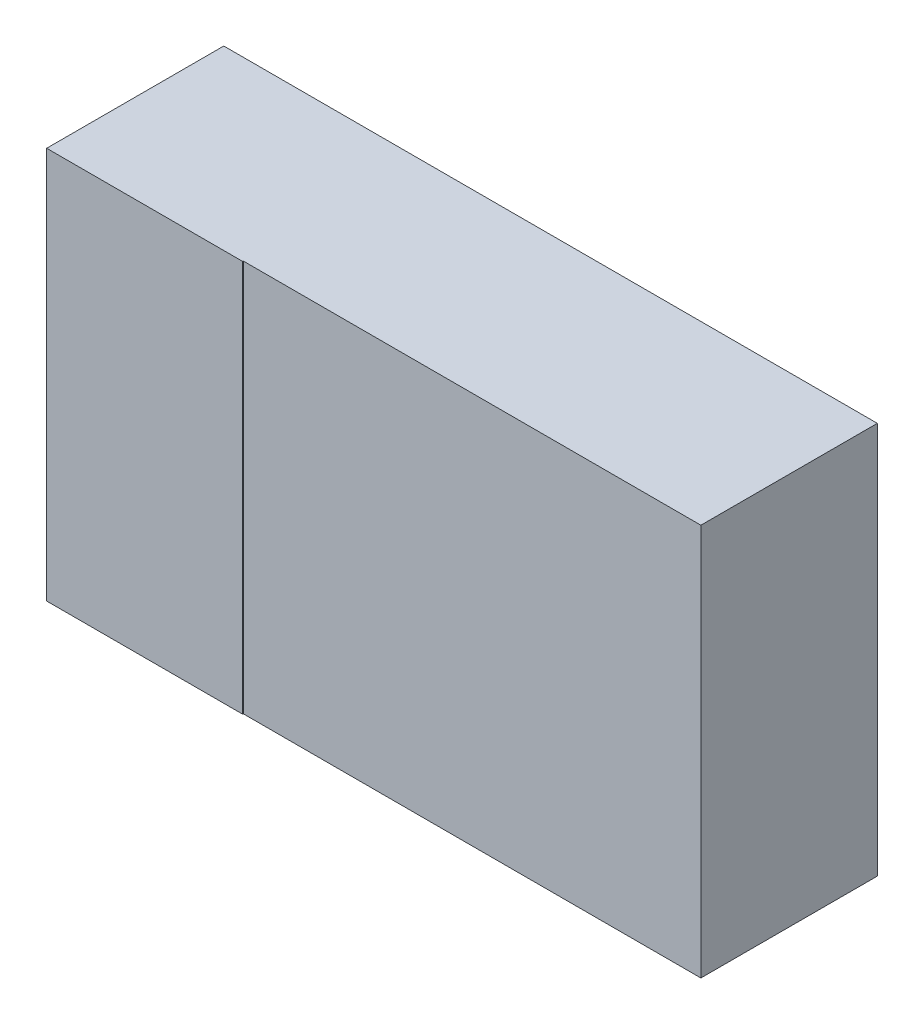
ISO-10303-21;
HEADER;
FILE_DESCRIPTION(('STEP AP214'),'2;1');
FILE_NAME('part.step','',(''),(''),'','','');
FILE_SCHEMA(('AUTOMOTIVE_DESIGN { 1 0 10303 214 1 1 1 1 }'));
ENDSEC;
DATA;
#1=APPLICATION_CONTEXT('core data for automotive mechanical design processes');
#2=APPLICATION_PROTOCOL_DEFINITION('international standard','automotive_design',2000,#1);
#3=PRODUCT_CONTEXT('',#1,'mechanical');
#4=PRODUCT('Part','Part','',(#3));
#5=PRODUCT_RELATED_PRODUCT_CATEGORY('part','',(#4));
#6=PRODUCT_DEFINITION_FORMATION('','',#4);
#7=PRODUCT_DEFINITION_CONTEXT('part definition',#1,'design');
#8=PRODUCT_DEFINITION('design','',#6,#7);
#9=PRODUCT_DEFINITION_SHAPE('','',#8);
#10=(LENGTH_UNIT() NAMED_UNIT(*) SI_UNIT(.MILLI.,.METRE.));
#11=(NAMED_UNIT(*) PLANE_ANGLE_UNIT() SI_UNIT($,.RADIAN.));
#12=(NAMED_UNIT(*) SI_UNIT($,.STERADIAN.) SOLID_ANGLE_UNIT());
#13=UNCERTAINTY_MEASURE_WITH_UNIT(LENGTH_MEASURE(1.E-05),#10,'distance_accuracy_value','');
#14=(GEOMETRIC_REPRESENTATION_CONTEXT(3) GLOBAL_UNCERTAINTY_ASSIGNED_CONTEXT((#13)) GLOBAL_UNIT_ASSIGNED_CONTEXT((#10,
#11,#12)) REPRESENTATION_CONTEXT('',''));
#15=CARTESIAN_POINT('',(0.,0.,0.));
#16=DIRECTION('',(0.,0.,1.));
#17=DIRECTION('',(1.,0.,0.));
#18=AXIS2_PLACEMENT_3D('',#15,#16,#17);
#19=CARTESIAN_POINT('',(0.,0.,0.3));
#20=DIRECTION('',(0.,0.,-1.));
#21=DIRECTION('',(-1.,0.,0.));
#22=AXIS2_PLACEMENT_3D('',#19,#20,#21);
#23=PLANE('',#22);
#24=DIRECTION('',(0.,1.,0.));
#25=VECTOR('',#24,1.);
#26=CARTESIAN_POINT('',(-0.2,0.3,0.3));
#27=LINE('',#26,#25);
#28=CARTESIAN_POINT('',(-0.2,-0.3,0.3));
#29=VERTEX_POINT('',#28);
#30=CARTESIAN_POINT('',(-0.2,0.3,0.3));
#31=VERTEX_POINT('',#30);
#32=EDGE_CURVE('E52',#29,#31,#27,.T.);
#33=ORIENTED_EDGE('',*,*,#32,.F.);
#34=DIRECTION('',(1.,0.,0.));
#35=VECTOR('',#34,1.);
#36=CARTESIAN_POINT('',(0.5,-0.3,0.3));
#37=LINE('',#36,#35);
#38=CARTESIAN_POINT('',(0.5,-0.3,0.3));
#39=VERTEX_POINT('',#38);
#40=EDGE_CURVE('E205',#29,#39,#37,.T.);
#41=ORIENTED_EDGE('',*,*,#40,.T.);
#42=DIRECTION('',(0.,1.,0.));
#43=VECTOR('',#42,1.);
#44=CARTESIAN_POINT('',(0.5,0.3,0.3));
#45=LINE('',#44,#43);
#46=CARTESIAN_POINT('',(0.5,0.3,0.3));
#47=VERTEX_POINT('',#46);
#48=EDGE_CURVE('E207',#39,#47,#45,.T.);
#49=ORIENTED_EDGE('',*,*,#48,.T.);
#50=DIRECTION('',(-1.,0.,0.));
#51=VECTOR('',#50,1.);
#52=CARTESIAN_POINT('',(0.5,0.3,0.3));
#53=LINE('',#52,#51);
#54=EDGE_CURVE('E210',#47,#31,#53,.T.);
#55=ORIENTED_EDGE('',*,*,#54,.T.);
#56=EDGE_LOOP('',(#33,#41,#49,#55));
#57=FACE_BOUND('',#56,.T.);
#58=ADVANCED_FACE('F37',(#57),#23,.F.);
#59=CARTESIAN_POINT('',(0.,0.,0.03));
#60=DIRECTION('',(0.,0.,-1.));
#61=DIRECTION('',(-1.,0.,0.));
#62=AXIS2_PLACEMENT_3D('',#59,#60,#61);
#63=PLANE('',#62);
#64=DIRECTION('',(1.,0.,0.));
#65=VECTOR('',#64,1.);
#66=CARTESIAN_POINT('',(-0.45,-0.25,0.03));
#67=LINE('',#66,#65);
#68=CARTESIAN_POINT('',(-0.45,-0.25,0.03));
#69=VERTEX_POINT('',#68);
#70=CARTESIAN_POINT('',(-0.2,-0.25,0.03));
#71=VERTEX_POINT('',#70);
#72=EDGE_CURVE('E235',#69,#71,#67,.T.);
#73=ORIENTED_EDGE('',*,*,#72,.T.);
#74=DIRECTION('',(0.,1.,0.));
#75=VECTOR('',#74,1.);
#76=CARTESIAN_POINT('',(-0.2,0.25,0.03));
#77=LINE('',#76,#75);
#78=CARTESIAN_POINT('',(-0.2,0.25,0.03));
#79=VERTEX_POINT('',#78);
#80=EDGE_CURVE('E225',#71,#79,#77,.T.);
#81=ORIENTED_EDGE('',*,*,#80,.T.);
#82=DIRECTION('',(-1.,0.,0.));
#83=VECTOR('',#82,1.);
#84=CARTESIAN_POINT('',(-0.45,0.25,0.03));
#85=LINE('',#84,#83);
#86=CARTESIAN_POINT('',(-0.45,0.25,0.03));
#87=VERTEX_POINT('',#86);
#88=EDGE_CURVE('E228',#79,#87,#85,.T.);
#89=ORIENTED_EDGE('',*,*,#88,.T.);
#90=DIRECTION('',(0.,-1.,0.));
#91=VECTOR('',#90,1.);
#92=CARTESIAN_POINT('',(-0.45,0.25,0.03));
#93=LINE('',#92,#91);
#94=EDGE_CURVE('E232',#87,#69,#93,.T.);
#95=ORIENTED_EDGE('',*,*,#94,.T.);
#96=EDGE_LOOP('',(#73,#81,#89,#95));
#97=FACE_BOUND('',#96,.T.);
#98=DIRECTION('',(0.,-1.,0.));
#99=VECTOR('',#98,1.);
#100=CARTESIAN_POINT('',(-0.5,0.3,0.03));
#101=LINE('',#100,#99);
#102=CARTESIAN_POINT('',(-0.5,0.3,0.03));
#103=VERTEX_POINT('',#102);
#104=CARTESIAN_POINT('',(-0.5,-0.3,0.03));
#105=VERTEX_POINT('',#104);
#106=EDGE_CURVE('E148',#103,#105,#101,.T.);
#107=ORIENTED_EDGE('',*,*,#106,.F.);
#108=DIRECTION('',(-1.,0.,0.));
#109=VECTOR('',#108,1.);
#110=CARTESIAN_POINT('',(0.5,0.3,0.03));
#111=LINE('',#110,#109);
#112=CARTESIAN_POINT('',(0.5,0.3,0.03));
#113=VERTEX_POINT('',#112);
#114=EDGE_CURVE('E208',#113,#103,#111,.T.);
#115=ORIENTED_EDGE('',*,*,#114,.F.);
#116=DIRECTION('',(0.,1.,0.));
#117=VECTOR('',#116,1.);
#118=CARTESIAN_POINT('',(0.5,0.3,0.03));
#119=LINE('',#118,#117);
#120=CARTESIAN_POINT('',(0.5,-0.3,0.03));
#121=VERTEX_POINT('',#120);
#122=EDGE_CURVE('E216',#121,#113,#119,.T.);
#123=ORIENTED_EDGE('',*,*,#122,.F.);
#124=DIRECTION('',(1.,0.,0.));
#125=VECTOR('',#124,1.);
#126=CARTESIAN_POINT('',(0.5,-0.3,0.03));
#127=LINE('',#126,#125);
#128=EDGE_CURVE('E214',#105,#121,#127,.T.);
#129=ORIENTED_EDGE('',*,*,#128,.F.);
#130=EDGE_LOOP('',(#107,#115,#123,#129));
#131=FACE_BOUND('',#130,.T.);
#132=DIRECTION('',(1.,0.,0.));
#133=VECTOR('',#132,1.);
#134=CARTESIAN_POINT('',(0.45,-0.25,0.03));
#135=LINE('',#134,#133);
#136=CARTESIAN_POINT('',(0.2,-0.25,0.03));
#137=VERTEX_POINT('',#136);
#138=CARTESIAN_POINT('',(0.45,-0.25,0.03));
#139=VERTEX_POINT('',#138);
#140=EDGE_CURVE('E184',#137,#139,#135,.T.);
#141=ORIENTED_EDGE('',*,*,#140,.T.);
#142=DIRECTION('',(0.,1.,0.));
#143=VECTOR('',#142,1.);
#144=CARTESIAN_POINT('',(0.45,0.25,0.03));
#145=LINE('',#144,#143);
#146=CARTESIAN_POINT('',(0.45,0.25,0.03));
#147=VERTEX_POINT('',#146);
#148=EDGE_CURVE('E60',#139,#147,#145,.T.);
#149=ORIENTED_EDGE('',*,*,#148,.T.);
#150=DIRECTION('',(-1.,0.,0.));
#151=VECTOR('',#150,1.);
#152=CARTESIAN_POINT('',(0.45,0.25,0.03));
#153=LINE('',#152,#151);
#154=CARTESIAN_POINT('',(0.2,0.25,0.03));
#155=VERTEX_POINT('',#154);
#156=EDGE_CURVE('E177',#147,#155,#153,.T.);
#157=ORIENTED_EDGE('',*,*,#156,.T.);
#158=DIRECTION('',(0.,-1.,0.));
#159=VECTOR('',#158,1.);
#160=CARTESIAN_POINT('',(0.2,0.25,0.03));
#161=LINE('',#160,#159);
#162=EDGE_CURVE('E181',#155,#137,#161,.T.);
#163=ORIENTED_EDGE('',*,*,#162,.T.);
#164=EDGE_LOOP('',(#141,#149,#157,#163));
#165=FACE_BOUND('',#164,.T.);
#166=ADVANCED_FACE('F267',(#97,#131,#165),#63,.T.);
#167=CARTESIAN_POINT('',(-0.2,0.25,0.03));
#168=DIRECTION('',(-1.,0.,0.));
#169=DIRECTION('',(0.,0.,1.));
#170=AXIS2_PLACEMENT_3D('',#167,#168,#169);
#171=PLANE('',#170);
#172=DIRECTION('',(0.,1.,0.));
#173=VECTOR('',#172,1.);
#174=CARTESIAN_POINT('',(-0.2,0.25,0.));
#175=LINE('',#174,#173);
#176=CARTESIAN_POINT('',(-0.2,-0.25,0.));
#177=VERTEX_POINT('',#176);
#178=CARTESIAN_POINT('',(-0.2,0.25,0.));
#179=VERTEX_POINT('',#178);
#180=EDGE_CURVE('E150',#177,#179,#175,.T.);
#181=ORIENTED_EDGE('',*,*,#180,.T.);
#182=DIRECTION('',(0.,0.,-1.));
#183=VECTOR('',#182,1.);
#184=CARTESIAN_POINT('',(-0.2,0.25,0.03));
#185=LINE('',#184,#183);
#186=EDGE_CURVE('E11',#79,#179,#185,.T.);
#187=ORIENTED_EDGE('',*,*,#186,.F.);
#188=ORIENTED_EDGE('',*,*,#80,.F.);
#189=DIRECTION('',(0.,0.,-1.));
#190=VECTOR('',#189,1.);
#191=CARTESIAN_POINT('',(-0.2,-0.25,0.03));
#192=LINE('',#191,#190);
#193=EDGE_CURVE('E238',#71,#177,#192,.T.);
#194=ORIENTED_EDGE('',*,*,#193,.T.);
#195=EDGE_LOOP('',(#181,#187,#188,#194));
#196=FACE_BOUND('',#195,.T.);
#197=ADVANCED_FACE('F39',(#196),#171,.F.);
#198=CARTESIAN_POINT('',(-0.45,0.25,0.03));
#199=DIRECTION('',(0.,-1.,0.));
#200=DIRECTION('',(0.,0.,-1.));
#201=AXIS2_PLACEMENT_3D('',#198,#199,#200);
#202=PLANE('',#201);
#203=DIRECTION('',(-1.,0.,0.));
#204=VECTOR('',#203,1.);
#205=CARTESIAN_POINT('',(-0.45,0.25,0.));
#206=LINE('',#205,#204);
#207=CARTESIAN_POINT('',(-0.45,0.25,0.));
#208=VERTEX_POINT('',#207);
#209=EDGE_CURVE('E241',#179,#208,#206,.T.);
#210=ORIENTED_EDGE('',*,*,#209,.T.);
#211=DIRECTION('',(0.,0.,-1.));
#212=VECTOR('',#211,1.);
#213=CARTESIAN_POINT('',(-0.45,0.25,0.03));
#214=LINE('',#213,#212);
#215=EDGE_CURVE('E45',#87,#208,#214,.T.);
#216=ORIENTED_EDGE('',*,*,#215,.F.);
#217=ORIENTED_EDGE('',*,*,#88,.F.);
#218=ORIENTED_EDGE('',*,*,#186,.T.);
#219=EDGE_LOOP('',(#210,#216,#217,#218));
#220=FACE_BOUND('',#219,.T.);
#221=ADVANCED_FACE('F269',(#220),#202,.F.);
#222=CARTESIAN_POINT('',(-0.45,0.25,0.03));
#223=DIRECTION('',(1.,0.,0.));
#224=DIRECTION('',(0.,1.,0.));
#225=AXIS2_PLACEMENT_3D('',#222,#223,#224);
#226=PLANE('',#225);
#227=DIRECTION('',(0.,-1.,0.));
#228=VECTOR('',#227,1.);
#229=CARTESIAN_POINT('',(-0.45,0.25,0.));
#230=LINE('',#229,#228);
#231=CARTESIAN_POINT('',(-0.45,-0.25,0.));
#232=VERTEX_POINT('',#231);
#233=EDGE_CURVE('E243',#208,#232,#230,.T.);
#234=ORIENTED_EDGE('',*,*,#233,.T.);
#235=DIRECTION('',(0.,0.,-1.));
#236=VECTOR('',#235,1.);
#237=CARTESIAN_POINT('',(-0.45,-0.25,0.03));
#238=LINE('',#237,#236);
#239=EDGE_CURVE('E248',#69,#232,#238,.T.);
#240=ORIENTED_EDGE('',*,*,#239,.F.);
#241=ORIENTED_EDGE('',*,*,#94,.F.);
#242=ORIENTED_EDGE('',*,*,#215,.T.);
#243=EDGE_LOOP('',(#234,#240,#241,#242));
#244=FACE_BOUND('',#243,.T.);
#245=ADVANCED_FACE('F254',(#244),#226,.F.);
#246=CARTESIAN_POINT('',(-0.45,-0.25,0.03));
#247=DIRECTION('',(0.,1.,0.));
#248=DIRECTION('',(0.,0.,1.));
#249=AXIS2_PLACEMENT_3D('',#246,#247,#248);
#250=PLANE('',#249);
#251=DIRECTION('',(1.,0.,0.));
#252=VECTOR('',#251,1.);
#253=CARTESIAN_POINT('',(-0.45,-0.25,0.));
#254=LINE('',#253,#252);
#255=EDGE_CURVE('E229',#232,#177,#254,.T.);
#256=ORIENTED_EDGE('',*,*,#255,.T.);
#257=ORIENTED_EDGE('',*,*,#193,.F.);
#258=ORIENTED_EDGE('',*,*,#72,.F.);
#259=ORIENTED_EDGE('',*,*,#239,.T.);
#260=EDGE_LOOP('',(#256,#257,#258,#259));
#261=FACE_BOUND('',#260,.T.);
#262=ADVANCED_FACE('F262',(#261),#250,.F.);
#263=CARTESIAN_POINT('',(0.,0.,0.));
#264=DIRECTION('',(0.,0.,1.));
#265=DIRECTION('',(1.,0.,0.));
#266=AXIS2_PLACEMENT_3D('',#263,#264,#265);
#267=PLANE('',#266);
#268=ORIENTED_EDGE('',*,*,#180,.F.);
#269=ORIENTED_EDGE('',*,*,#255,.F.);
#270=ORIENTED_EDGE('',*,*,#233,.F.);
#271=ORIENTED_EDGE('',*,*,#209,.F.);
#272=EDGE_LOOP('',(#268,#269,#270,#271));
#273=FACE_BOUND('',#272,.T.);
#274=ADVANCED_FACE('F259',(#273),#267,.F.);
#275=CARTESIAN_POINT('',(-0.5,0.3,0.3));
#276=DIRECTION('',(1.,0.,0.));
#277=DIRECTION('',(0.,0.,-1.));
#278=AXIS2_PLACEMENT_3D('',#275,#276,#277);
#279=PLANE('',#278);
#280=ORIENTED_EDGE('',*,*,#106,.T.);
#281=DIRECTION('',(0.,0.,-1.));
#282=VECTOR('',#281,1.);
#283=CARTESIAN_POINT('',(-0.5,-0.3,0.3));
#284=LINE('',#283,#282);
#285=CARTESIAN_POINT('',(-0.5,-0.3,0.301));
#286=VERTEX_POINT('',#285);
#287=EDGE_CURVE('E141',#286,#105,#284,.T.);
#288=ORIENTED_EDGE('',*,*,#287,.F.);
#289=DIRECTION('',(0.,-1.,0.));
#290=VECTOR('',#289,1.);
#291=CARTESIAN_POINT('',(-0.5,0.3,0.301));
#292=LINE('',#291,#290);
#293=CARTESIAN_POINT('',(-0.5,0.3,0.301));
#294=VERTEX_POINT('',#293);
#295=EDGE_CURVE('E146',#294,#286,#292,.T.);
#296=ORIENTED_EDGE('',*,*,#295,.F.);
#297=DIRECTION('',(0.,0.,-1.));
#298=VECTOR('',#297,1.);
#299=CARTESIAN_POINT('',(-0.5,0.3,0.3));
#300=LINE('',#299,#298);
#301=EDGE_CURVE('E212',#294,#103,#300,.T.);
#302=ORIENTED_EDGE('',*,*,#301,.T.);
#303=EDGE_LOOP('',(#280,#288,#296,#302));
#304=FACE_BOUND('',#303,.T.);
#305=ADVANCED_FACE('F143',(#304),#279,.F.);
#306=CARTESIAN_POINT('',(0.5,-0.3,0.3));
#307=DIRECTION('',(0.,1.,0.));
#308=DIRECTION('',(-1.,0.,0.));
#309=AXIS2_PLACEMENT_3D('',#306,#307,#308);
#310=PLANE('',#309);
#311=ORIENTED_EDGE('',*,*,#128,.T.);
#312=DIRECTION('',(0.,0.,-1.));
#313=VECTOR('',#312,1.);
#314=CARTESIAN_POINT('',(0.5,-0.3,0.3));
#315=LINE('',#314,#313);
#316=EDGE_CURVE('E151',#39,#121,#315,.T.);
#317=ORIENTED_EDGE('',*,*,#316,.F.);
#318=ORIENTED_EDGE('',*,*,#40,.F.);
#319=DIRECTION('',(0.,0.,-1.));
#320=VECTOR('',#319,1.);
#321=CARTESIAN_POINT('',(-0.2,-0.3,0.301));
#322=LINE('',#321,#320);
#323=CARTESIAN_POINT('',(-0.2,-0.3,0.301));
#324=VERTEX_POINT('',#323);
#325=EDGE_CURVE('E157',#324,#29,#322,.T.);
#326=ORIENTED_EDGE('',*,*,#325,.F.);
#327=DIRECTION('',(1.,0.,0.));
#328=VECTOR('',#327,1.);
#329=CARTESIAN_POINT('',(-0.5,-0.3,0.301));
#330=LINE('',#329,#328);
#331=EDGE_CURVE('E154',#286,#324,#330,.T.);
#332=ORIENTED_EDGE('',*,*,#331,.F.);
#333=ORIENTED_EDGE('',*,*,#287,.T.);
#334=EDGE_LOOP('',(#311,#317,#318,#326,#332,#333));
#335=FACE_BOUND('',#334,.T.);
#336=ADVANCED_FACE('F155',(#335),#310,.F.);
#337=CARTESIAN_POINT('',(0.5,0.3,0.3));
#338=DIRECTION('',(-1.,0.,0.));
#339=DIRECTION('',(0.,-1.,0.));
#340=AXIS2_PLACEMENT_3D('',#337,#338,#339);
#341=PLANE('',#340);
#342=ORIENTED_EDGE('',*,*,#122,.T.);
#343=DIRECTION('',(0.,0.,-1.));
#344=VECTOR('',#343,1.);
#345=CARTESIAN_POINT('',(0.5,0.3,0.3));
#346=LINE('',#345,#344);
#347=EDGE_CURVE('E220',#47,#113,#346,.T.);
#348=ORIENTED_EDGE('',*,*,#347,.F.);
#349=ORIENTED_EDGE('',*,*,#48,.F.);
#350=ORIENTED_EDGE('',*,*,#316,.T.);
#351=EDGE_LOOP('',(#342,#348,#349,#350));
#352=FACE_BOUND('',#351,.T.);
#353=ADVANCED_FACE('F289',(#352),#341,.F.);
#354=CARTESIAN_POINT('',(0.5,0.3,0.3));
#355=DIRECTION('',(0.,-1.,0.));
#356=DIRECTION('',(1.,0.,0.));
#357=AXIS2_PLACEMENT_3D('',#354,#355,#356);
#358=PLANE('',#357);
#359=ORIENTED_EDGE('',*,*,#114,.T.);
#360=ORIENTED_EDGE('',*,*,#301,.F.);
#361=DIRECTION('',(-1.,0.,0.));
#362=VECTOR('',#361,1.);
#363=CARTESIAN_POINT('',(-0.5,0.3,0.301));
#364=LINE('',#363,#362);
#365=CARTESIAN_POINT('',(-0.2,0.3,0.301));
#366=VERTEX_POINT('',#365);
#367=EDGE_CURVE('E165',#366,#294,#364,.T.);
#368=ORIENTED_EDGE('',*,*,#367,.F.);
#369=DIRECTION('',(0.,0.,-1.));
#370=VECTOR('',#369,1.);
#371=CARTESIAN_POINT('',(-0.2,0.3,0.301));
#372=LINE('',#371,#370);
#373=EDGE_CURVE('E170',#366,#31,#372,.T.);
#374=ORIENTED_EDGE('',*,*,#373,.T.);
#375=ORIENTED_EDGE('',*,*,#54,.F.);
#376=ORIENTED_EDGE('',*,*,#347,.T.);
#377=EDGE_LOOP('',(#359,#360,#368,#374,#375,#376));
#378=FACE_BOUND('',#377,.T.);
#379=ADVANCED_FACE('F286',(#378),#358,.F.);
#380=CARTESIAN_POINT('',(0.45,0.25,0.03));
#381=DIRECTION('',(-1.,0.,0.));
#382=DIRECTION('',(0.,-1.,0.));
#383=AXIS2_PLACEMENT_3D('',#380,#381,#382);
#384=PLANE('',#383);
#385=DIRECTION('',(0.,1.,0.));
#386=VECTOR('',#385,1.);
#387=CARTESIAN_POINT('',(0.45,0.25,0.));
#388=LINE('',#387,#386);
#389=CARTESIAN_POINT('',(0.45,-0.25,0.));
#390=VERTEX_POINT('',#389);
#391=CARTESIAN_POINT('',(0.45,0.25,0.));
#392=VERTEX_POINT('',#391);
#393=EDGE_CURVE('E175',#390,#392,#388,.T.);
#394=ORIENTED_EDGE('',*,*,#393,.T.);
#395=DIRECTION('',(0.,0.,-1.));
#396=VECTOR('',#395,1.);
#397=CARTESIAN_POINT('',(0.45,0.25,0.03));
#398=LINE('',#397,#396);
#399=EDGE_CURVE('E202',#147,#392,#398,.T.);
#400=ORIENTED_EDGE('',*,*,#399,.F.);
#401=ORIENTED_EDGE('',*,*,#148,.F.);
#402=DIRECTION('',(0.,0.,-1.));
#403=VECTOR('',#402,1.);
#404=CARTESIAN_POINT('',(0.45,-0.25,0.03));
#405=LINE('',#404,#403);
#406=EDGE_CURVE('E187',#139,#390,#405,.T.);
#407=ORIENTED_EDGE('',*,*,#406,.T.);
#408=EDGE_LOOP('',(#394,#400,#401,#407));
#409=FACE_BOUND('',#408,.T.);
#410=ADVANCED_FACE('F283',(#409),#384,.F.);
#411=CARTESIAN_POINT('',(0.45,0.25,0.03));
#412=DIRECTION('',(0.,-1.,0.));
#413=DIRECTION('',(1.,0.,0.));
#414=AXIS2_PLACEMENT_3D('',#411,#412,#413);
#415=PLANE('',#414);
#416=DIRECTION('',(-1.,0.,0.));
#417=VECTOR('',#416,1.);
#418=CARTESIAN_POINT('',(0.45,0.25,0.));
#419=LINE('',#418,#417);
#420=CARTESIAN_POINT('',(0.2,0.25,0.));
#421=VERTEX_POINT('',#420);
#422=EDGE_CURVE('E190',#392,#421,#419,.T.);
#423=ORIENTED_EDGE('',*,*,#422,.T.);
#424=DIRECTION('',(0.,0.,-1.));
#425=VECTOR('',#424,1.);
#426=CARTESIAN_POINT('',(0.2,0.25,0.03));
#427=LINE('',#426,#425);
#428=EDGE_CURVE('E199',#155,#421,#427,.T.);
#429=ORIENTED_EDGE('',*,*,#428,.F.);
#430=ORIENTED_EDGE('',*,*,#156,.F.);
#431=ORIENTED_EDGE('',*,*,#399,.T.);
#432=EDGE_LOOP('',(#423,#429,#430,#431));
#433=FACE_BOUND('',#432,.T.);
#434=ADVANCED_FACE('F333',(#433),#415,.F.);
#435=CARTESIAN_POINT('',(0.2,0.25,0.03));
#436=DIRECTION('',(1.,0.,0.));
#437=DIRECTION('',(0.,1.,0.));
#438=AXIS2_PLACEMENT_3D('',#435,#436,#437);
#439=PLANE('',#438);
#440=DIRECTION('',(0.,-1.,0.));
#441=VECTOR('',#440,1.);
#442=CARTESIAN_POINT('',(0.2,0.25,0.));
#443=LINE('',#442,#441);
#444=CARTESIAN_POINT('',(0.2,-0.25,0.));
#445=VERTEX_POINT('',#444);
#446=EDGE_CURVE('E192',#421,#445,#443,.T.);
#447=ORIENTED_EDGE('',*,*,#446,.T.);
#448=DIRECTION('',(0.,0.,-1.));
#449=VECTOR('',#448,1.);
#450=CARTESIAN_POINT('',(0.2,-0.25,0.03));
#451=LINE('',#450,#449);
#452=EDGE_CURVE('E196',#137,#445,#451,.T.);
#453=ORIENTED_EDGE('',*,*,#452,.F.);
#454=ORIENTED_EDGE('',*,*,#162,.F.);
#455=ORIENTED_EDGE('',*,*,#428,.T.);
#456=EDGE_LOOP('',(#447,#453,#454,#455));
#457=FACE_BOUND('',#456,.T.);
#458=ADVANCED_FACE('F339',(#457),#439,.F.);
#459=CARTESIAN_POINT('',(0.45,-0.25,0.03));
#460=DIRECTION('',(0.,1.,0.));
#461=DIRECTION('',(-1.,0.,0.));
#462=AXIS2_PLACEMENT_3D('',#459,#460,#461);
#463=PLANE('',#462);
#464=DIRECTION('',(1.,0.,0.));
#465=VECTOR('',#464,1.);
#466=CARTESIAN_POINT('',(0.45,-0.25,0.));
#467=LINE('',#466,#465);
#468=EDGE_CURVE('E178',#445,#390,#467,.T.);
#469=ORIENTED_EDGE('',*,*,#468,.T.);
#470=ORIENTED_EDGE('',*,*,#406,.F.);
#471=ORIENTED_EDGE('',*,*,#140,.F.);
#472=ORIENTED_EDGE('',*,*,#452,.T.);
#473=EDGE_LOOP('',(#469,#470,#471,#472));
#474=FACE_BOUND('',#473,.T.);
#475=ADVANCED_FACE('F346',(#474),#463,.F.);
#476=CARTESIAN_POINT('',(0.,0.,0.));
#477=DIRECTION('',(0.,0.,-1.));
#478=DIRECTION('',(-1.,0.,0.));
#479=AXIS2_PLACEMENT_3D('',#476,#477,#478);
#480=PLANE('',#479);
#481=ORIENTED_EDGE('',*,*,#393,.F.);
#482=ORIENTED_EDGE('',*,*,#468,.F.);
#483=ORIENTED_EDGE('',*,*,#446,.F.);
#484=ORIENTED_EDGE('',*,*,#422,.F.);
#485=EDGE_LOOP('',(#481,#482,#483,#484));
#486=FACE_BOUND('',#485,.T.);
#487=ADVANCED_FACE('F354',(#486),#480,.T.);
#488=CARTESIAN_POINT('',(-0.2,0.3,0.301));
#489=DIRECTION('',(-1.,0.,0.));
#490=DIRECTION('',(0.,-1.,0.));
#491=AXIS2_PLACEMENT_3D('',#488,#489,#490);
#492=PLANE('',#491);
#493=ORIENTED_EDGE('',*,*,#32,.T.);
#494=ORIENTED_EDGE('',*,*,#373,.F.);
#495=DIRECTION('',(0.,1.,0.));
#496=VECTOR('',#495,1.);
#497=CARTESIAN_POINT('',(-0.2,0.3,0.301));
#498=LINE('',#497,#496);
#499=EDGE_CURVE('E160',#324,#366,#498,.T.);
#500=ORIENTED_EDGE('',*,*,#499,.F.);
#501=ORIENTED_EDGE('',*,*,#325,.T.);
#502=EDGE_LOOP('',(#493,#494,#500,#501));
#503=FACE_BOUND('',#502,.T.);
#504=ADVANCED_FACE('F362',(#503),#492,.F.);
#505=CARTESIAN_POINT('',(0.,0.,0.301));
#506=DIRECTION('',(0.,0.,1.));
#507=DIRECTION('',(1.,0.,0.));
#508=AXIS2_PLACEMENT_3D('',#505,#506,#507);
#509=PLANE('',#508);
#510=ORIENTED_EDGE('',*,*,#295,.T.);
#511=ORIENTED_EDGE('',*,*,#331,.T.);
#512=ORIENTED_EDGE('',*,*,#499,.T.);
#513=ORIENTED_EDGE('',*,*,#367,.T.);
#514=EDGE_LOOP('',(#510,#511,#512,#513));
#515=FACE_BOUND('',#514,.T.);
#516=ADVANCED_FACE('F163',(#515),#509,.T.);
#517=CLOSED_SHELL('',(#58,#166,#197,#221,#245,#262,#274,#305,#336,#353,#379,#410,#434,#458,#475,
#487,#504,#516));
#518=MANIFOLD_SOLID_BREP('B2',#517);
#519=ADVANCED_BREP_SHAPE_REPRESENTATION('',(#18,#518),#14);
#520=SHAPE_DEFINITION_REPRESENTATION(#9,#519);
ENDSEC;
END-ISO-10303-21;
